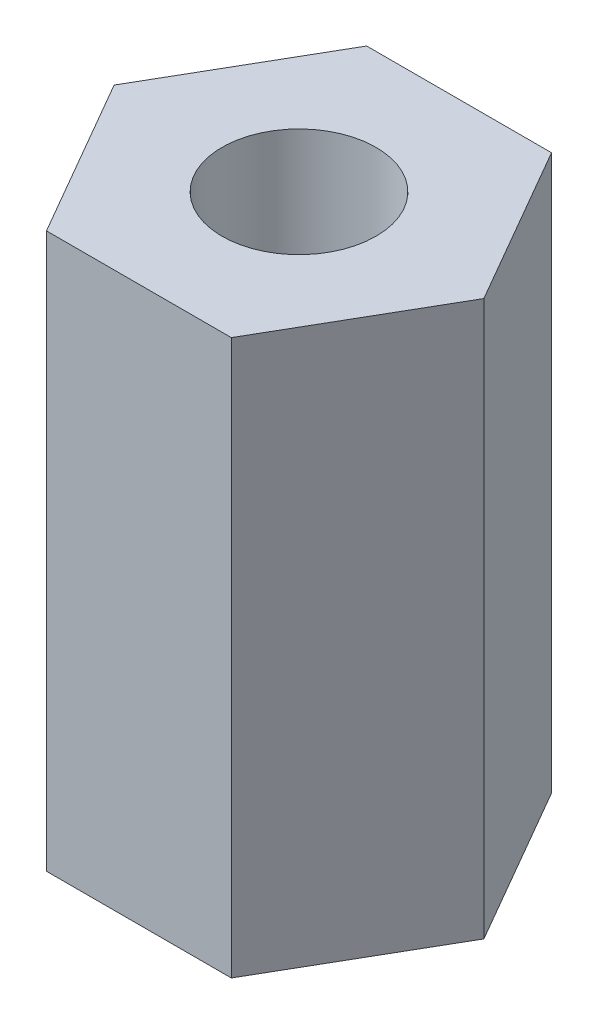
ISO-10303-21;
HEADER;
FILE_DESCRIPTION(('STEP AP214'),'2;1');
FILE_NAME('part.step','',(''),(''),'','','');
FILE_SCHEMA(('AUTOMOTIVE_DESIGN { 1 0 10303 214 1 1 1 1 }'));
ENDSEC;
DATA;
#1=APPLICATION_CONTEXT('core data for automotive mechanical design processes');
#2=APPLICATION_PROTOCOL_DEFINITION('international standard','automotive_design',2000,#1);
#3=PRODUCT_CONTEXT('',#1,'mechanical');
#4=PRODUCT('Part','Part','',(#3));
#5=PRODUCT_RELATED_PRODUCT_CATEGORY('part','',(#4));
#6=PRODUCT_DEFINITION_FORMATION('','',#4);
#7=PRODUCT_DEFINITION_CONTEXT('part definition',#1,'design');
#8=PRODUCT_DEFINITION('design','',#6,#7);
#9=PRODUCT_DEFINITION_SHAPE('','',#8);
#10=(LENGTH_UNIT() NAMED_UNIT(*) SI_UNIT(.MILLI.,.METRE.));
#11=(NAMED_UNIT(*) PLANE_ANGLE_UNIT() SI_UNIT($,.RADIAN.));
#12=(NAMED_UNIT(*) SI_UNIT($,.STERADIAN.) SOLID_ANGLE_UNIT());
#13=UNCERTAINTY_MEASURE_WITH_UNIT(LENGTH_MEASURE(1.E-05),#10,'distance_accuracy_value','');
#14=(GEOMETRIC_REPRESENTATION_CONTEXT(3) GLOBAL_UNCERTAINTY_ASSIGNED_CONTEXT((#13)) GLOBAL_UNIT_ASSIGNED_CONTEXT((#10,
#11,#12)) REPRESENTATION_CONTEXT('',''));
#15=CARTESIAN_POINT('',(0.,0.,0.));
#16=DIRECTION('',(0.,0.,1.));
#17=DIRECTION('',(1.,0.,0.));
#18=AXIS2_PLACEMENT_3D('',#15,#16,#17);
#19=CARTESIAN_POINT('',(1.5,-19.8,-2.598076211));
#20=DIRECTION('',(-0.866025403754996,0.,0.500000000050997));
#21=DIRECTION('',(0.500000000050997,0.,0.866025403754996));
#22=AXIS2_PLACEMENT_3D('',#19,#20,#21);
#23=PLANE('',#22);
#24=DIRECTION('',(-0.500000000039245,0.,-0.86602540376178));
#25=VECTOR('',#24,1.);
#26=CARTESIAN_POINT('',(2.9999999999914,-11.,1.48889425227083E-11));
#27=LINE('',#26,#25);
#28=CARTESIAN_POINT('',(2.99999999994471,-11.,-8.08820188573774E-11));
#29=VERTEX_POINT('',#28);
#30=CARTESIAN_POINT('',(1.49999999996019,-11.,-2.59807621099354));
#31=VERTEX_POINT('',#30);
#32=EDGE_CURVE('E112',#29,#31,#27,.T.);
#33=ORIENTED_EDGE('',*,*,#32,.F.);
#34=DIRECTION('',(0.,1.,0.));
#35=VECTOR('',#34,1.);
#36=CARTESIAN_POINT('',(2.9999999999914,-19.8,1.48888315316058E-11));
#37=LINE('',#36,#35);
#38=CARTESIAN_POINT('',(2.99999999984486,-20.,-8.46048744331994E-11));
#39=VERTEX_POINT('',#38);
#40=EDGE_CURVE('E90',#29,#39,#37,.F.);
#41=ORIENTED_EDGE('',*,*,#40,.T.);
#42=DIRECTION('',(-0.5,0.,-0.866025403784439));
#43=VECTOR('',#42,1.);
#44=CARTESIAN_POINT('',(2.99999999959204,-20.,0.));
#45=LINE('',#44,#43);
#46=CARTESIAN_POINT('',(1.49999999990174,-20.,-2.59807621099355));
#47=VERTEX_POINT('',#46);
#48=EDGE_CURVE('E66',#39,#47,#45,.T.);
#49=ORIENTED_EDGE('',*,*,#48,.T.);
#50=DIRECTION('',(0.,1.,0.));
#51=VECTOR('',#50,1.);
#52=CARTESIAN_POINT('',(1.49999999979602,-19.8,-2.598076211));
#53=LINE('',#52,#51);
#54=EDGE_CURVE('E73',#47,#31,#53,.T.);
#55=ORIENTED_EDGE('',*,*,#54,.T.);
#56=EDGE_LOOP('',(#33,#41,#49,#55));
#57=FACE_BOUND('',#56,.T.);
#58=ADVANCED_FACE('F17',(#57),#23,.F.);
#59=CARTESIAN_POINT('',(-1.5,-19.8,-2.598076211));
#60=DIRECTION('',(0.,0.,1.));
#61=DIRECTION('',(1.,0.,0.));
#62=AXIS2_PLACEMENT_3D('',#59,#60,#61);
#63=PLANE('',#62);
#64=DIRECTION('',(1.,0.,0.));
#65=VECTOR('',#64,1.);
#66=CARTESIAN_POINT('',(0.,-11.,-2.598076211));
#67=LINE('',#66,#65);
#68=CARTESIAN_POINT('',(-1.4999999999788,-11.,-2.59807621102208));
#69=VERTEX_POINT('',#68);
#70=EDGE_CURVE('E77',#31,#69,#67,.F.);
#71=ORIENTED_EDGE('',*,*,#70,.F.);
#72=ORIENTED_EDGE('',*,*,#54,.F.);
#73=DIRECTION('',(1.,0.,0.));
#74=VECTOR('',#73,1.);
#75=CARTESIAN_POINT('',(-2.802288611,-20.,-2.59807621100001));
#76=LINE('',#75,#74);
#77=CARTESIAN_POINT('',(-1.4999999999278,-20.,-2.59807621102209));
#78=VERTEX_POINT('',#77);
#79=EDGE_CURVE('E76',#47,#78,#76,.F.);
#80=ORIENTED_EDGE('',*,*,#79,.T.);
#81=DIRECTION('',(0.,1.,0.));
#82=VECTOR('',#81,1.);
#83=CARTESIAN_POINT('',(-1.499999999949,-19.8,-2.59807621108834));
#84=LINE('',#83,#82);
#85=EDGE_CURVE('E80',#78,#69,#84,.T.);
#86=ORIENTED_EDGE('',*,*,#85,.T.);
#87=EDGE_LOOP('',(#71,#72,#80,#86));
#88=FACE_BOUND('',#87,.T.);
#89=ADVANCED_FACE('F74',(#88),#63,.F.);
#90=CARTESIAN_POINT('',(-3.,-19.8,0.));
#91=DIRECTION('',(0.866025403754996,0.,0.500000000050997));
#92=DIRECTION('',(0.500000000050997,0.,-0.866025403754996));
#93=AXIS2_PLACEMENT_3D('',#90,#91,#92);
#94=PLANE('',#93);
#95=DIRECTION('',(-0.50000000001215,0.,0.866025403777424));
#96=VECTOR('',#95,1.);
#97=CARTESIAN_POINT('',(-1.4999999999831,-11.,-2.59807621102927));
#98=LINE('',#97,#96);
#99=CARTESIAN_POINT('',(-2.9999999999745,-11.,1.11448339535898E-10));
#100=VERTEX_POINT('',#99);
#101=EDGE_CURVE('E106',#69,#100,#98,.T.);
#102=ORIENTED_EDGE('',*,*,#101,.F.);
#103=ORIENTED_EDGE('',*,*,#85,.F.);
#104=DIRECTION('',(-0.5,0.,0.866025403784439));
#105=VECTOR('',#104,1.);
#106=CARTESIAN_POINT('',(-1.49999999979602,-20.,-2.59807621100001));
#107=LINE('',#106,#105);
#108=CARTESIAN_POINT('',(-2.99999999989193,-20.,7.78060918561481E-11));
#109=VERTEX_POINT('',#108);
#110=EDGE_CURVE('E88',#78,#109,#107,.T.);
#111=ORIENTED_EDGE('',*,*,#110,.T.);
#112=DIRECTION('',(0.,1.,0.));
#113=VECTOR('',#112,1.);
#114=CARTESIAN_POINT('',(-2.99999999989801,-19.8,1.76653830452622E-10));
#115=LINE('',#114,#113);
#116=EDGE_CURVE('E101',#109,#100,#115,.T.);
#117=ORIENTED_EDGE('',*,*,#116,.T.);
#118=EDGE_LOOP('',(#102,#103,#111,#117));
#119=FACE_BOUND('',#118,.T.);
#120=ADVANCED_FACE('F107',(#119),#94,.F.);
#121=CARTESIAN_POINT('',(-1.5,-19.8,2.598076211));
#122=DIRECTION('',(0.866025403754996,0.,-0.500000000050997));
#123=DIRECTION('',(-0.500000000050997,0.,-0.866025403754996));
#124=AXIS2_PLACEMENT_3D('',#121,#122,#123);
#125=PLANE('',#124);
#126=DIRECTION('',(0.500000000043543,0.,0.866025403759299));
#127=VECTOR('',#126,1.);
#128=CARTESIAN_POINT('',(-2.99999999992231,-11.,1.34569872606294E-10));
#129=LINE('',#128,#127);
#130=CARTESIAN_POINT('',(-1.49999999996019,-11.,2.59807621099354));
#131=VERTEX_POINT('',#130);
#132=EDGE_CURVE('E109',#100,#131,#129,.T.);
#133=ORIENTED_EDGE('',*,*,#132,.F.);
#134=ORIENTED_EDGE('',*,*,#116,.F.);
#135=DIRECTION('',(0.5,0.,0.866025403784439));
#136=VECTOR('',#135,1.);
#137=CARTESIAN_POINT('',(-2.99999999959203,-20.,0.));
#138=LINE('',#137,#136);
#139=CARTESIAN_POINT('',(-1.49999999990174,-20.,2.59807621099355));
#140=VERTEX_POINT('',#139);
#141=EDGE_CURVE('E122',#109,#140,#138,.T.);
#142=ORIENTED_EDGE('',*,*,#141,.T.);
#143=DIRECTION('',(0.,1.,0.));
#144=VECTOR('',#143,1.);
#145=CARTESIAN_POINT('',(-1.49999999979602,-19.8,2.598076211));
#146=LINE('',#145,#144);
#147=EDGE_CURVE('E98',#140,#131,#146,.T.);
#148=ORIENTED_EDGE('',*,*,#147,.T.);
#149=EDGE_LOOP('',(#133,#134,#142,#148));
#150=FACE_BOUND('',#149,.T.);
#151=ADVANCED_FACE('F125',(#150),#125,.F.);
#152=CARTESIAN_POINT('',(1.5,-19.8,2.598076211));
#153=DIRECTION('',(0.,0.,-1.));
#154=DIRECTION('',(-1.,0.,0.));
#155=AXIS2_PLACEMENT_3D('',#152,#153,#154);
#156=PLANE('',#155);
#157=DIRECTION('',(1.,0.,0.));
#158=VECTOR('',#157,1.);
#159=CARTESIAN_POINT('',(0.,-11.,2.598076211));
#160=LINE('',#159,#158);
#161=CARTESIAN_POINT('',(1.49999999998725,-11.,2.59807621102208));
#162=VERTEX_POINT('',#161);
#163=EDGE_CURVE('E33',#131,#162,#160,.T.);
#164=ORIENTED_EDGE('',*,*,#163,.F.);
#165=ORIENTED_EDGE('',*,*,#147,.F.);
#166=DIRECTION('',(1.,0.,0.));
#167=VECTOR('',#166,1.);
#168=CARTESIAN_POINT('',(-2.802288611,-20.,2.59807621100001));
#169=LINE('',#168,#167);
#170=CARTESIAN_POINT('',(1.49999999993625,-20.,2.59807621102209));
#171=VERTEX_POINT('',#170);
#172=EDGE_CURVE('E119',#140,#171,#169,.T.);
#173=ORIENTED_EDGE('',*,*,#172,.T.);
#174=DIRECTION('',(0.,1.,0.));
#175=VECTOR('',#174,1.);
#176=CARTESIAN_POINT('',(1.499999999949,-19.8,2.59807621108833));
#177=LINE('',#176,#175);
#178=EDGE_CURVE('E93',#171,#162,#177,.T.);
#179=ORIENTED_EDGE('',*,*,#178,.T.);
#180=EDGE_LOOP('',(#164,#165,#173,#179));
#181=FACE_BOUND('',#180,.T.);
#182=ADVANCED_FACE('F127',(#181),#156,.F.);
#183=CARTESIAN_POINT('',(3.,-19.8,0.));
#184=DIRECTION('',(-0.866025403754996,0.,-0.500000000050997));
#185=DIRECTION('',(-0.500000000050997,0.,0.866025403754996));
#186=AXIS2_PLACEMENT_3D('',#183,#184,#185);
#187=PLANE('',#186);
#188=ORIENTED_EDGE('',*,*,#40,.F.);
#189=DIRECTION('',(0.500000000050997,0.,-0.866025403754996));
#190=VECTOR('',#189,1.);
#191=CARTESIAN_POINT('',(1.5,-11.,2.598076211));
#192=LINE('',#191,#190);
#193=EDGE_CURVE('E129',#162,#29,#192,.T.);
#194=ORIENTED_EDGE('',*,*,#193,.F.);
#195=ORIENTED_EDGE('',*,*,#178,.F.);
#196=DIRECTION('',(0.5,0.,-0.866025403784439));
#197=VECTOR('',#196,1.);
#198=CARTESIAN_POINT('',(1.49999999979602,-20.,2.59807621100001));
#199=LINE('',#198,#197);
#200=EDGE_CURVE('E117',#171,#39,#199,.T.);
#201=ORIENTED_EDGE('',*,*,#200,.T.);
#202=EDGE_LOOP('',(#188,#194,#195,#201));
#203=FACE_BOUND('',#202,.T.);
#204=ADVANCED_FACE('F147',(#203),#187,.F.);
#205=CARTESIAN_POINT('',(-2.802288611,-20.,-2.398076211));
#206=DIRECTION('',(0.,1.,0.));
#207=DIRECTION('',(0.,0.,1.));
#208=AXIS2_PLACEMENT_3D('',#205,#206,#207);
#209=PLANE('',#208);
#210=ORIENTED_EDGE('',*,*,#172,.F.);
#211=ORIENTED_EDGE('',*,*,#141,.F.);
#212=ORIENTED_EDGE('',*,*,#110,.F.);
#213=ORIENTED_EDGE('',*,*,#79,.F.);
#214=ORIENTED_EDGE('',*,*,#48,.F.);
#215=ORIENTED_EDGE('',*,*,#200,.F.);
#216=EDGE_LOOP('',(#210,#211,#212,#213,#214,#215));
#217=FACE_BOUND('',#216,.T.);
#218=CARTESIAN_POINT('',(0.,-20.,0.));
#219=DIRECTION('',(0.,-1.,0.));
#220=DIRECTION('',(1.,0.,0.));
#221=AXIS2_PLACEMENT_3D('',#218,#219,#220);
#222=CIRCLE('',#221,1.25);
#223=CARTESIAN_POINT('',(1.25000000000001,-20.,0.));
#224=VERTEX_POINT('',#223);
#225=EDGE_CURVE('E20',#224,#224,#222,.F.);
#226=ORIENTED_EDGE('',*,*,#225,.T.);
#227=EDGE_LOOP('',(#226));
#228=FACE_BOUND('',#227,.T.);
#229=ADVANCED_FACE('F84',(#217,#228),#209,.F.);
#230=CARTESIAN_POINT('',(0.,-11.,0.));
#231=DIRECTION('',(0.,1.,0.));
#232=DIRECTION('',(0.,0.,1.));
#233=AXIS2_PLACEMENT_3D('',#230,#231,#232);
#234=PLANE('',#233);
#235=ORIENTED_EDGE('',*,*,#163,.T.);
#236=ORIENTED_EDGE('',*,*,#193,.T.);
#237=ORIENTED_EDGE('',*,*,#32,.T.);
#238=ORIENTED_EDGE('',*,*,#70,.T.);
#239=ORIENTED_EDGE('',*,*,#101,.T.);
#240=ORIENTED_EDGE('',*,*,#132,.T.);
#241=EDGE_LOOP('',(#235,#236,#237,#238,#239,#240));
#242=FACE_BOUND('',#241,.T.);
#243=CARTESIAN_POINT('',(0.,-11.,0.));
#244=DIRECTION('',(0.,-1.,0.));
#245=DIRECTION('',(1.,0.,0.));
#246=AXIS2_PLACEMENT_3D('',#243,#244,#245);
#247=CIRCLE('',#246,1.25);
#248=CARTESIAN_POINT('',(1.25,-11.,0.));
#249=VERTEX_POINT('',#248);
#250=EDGE_CURVE('E11',#249,#249,#247,.T.);
#251=ORIENTED_EDGE('',*,*,#250,.T.);
#252=EDGE_LOOP('',(#251));
#253=FACE_BOUND('',#252,.T.);
#254=ADVANCED_FACE('F137',(#242,#253),#234,.T.);
#255=CARTESIAN_POINT('',(0.,-10.,0.));
#256=DIRECTION('',(0.,-1.,0.));
#257=DIRECTION('',(1.,0.,0.));
#258=AXIS2_PLACEMENT_3D('',#255,#256,#257);
#259=CYLINDRICAL_SURFACE('',#258,1.25);
#260=ORIENTED_EDGE('',*,*,#225,.F.);
#261=EDGE_LOOP('',(#260));
#262=FACE_BOUND('',#261,.T.);
#263=ORIENTED_EDGE('',*,*,#250,.F.);
#264=EDGE_LOOP('',(#263));
#265=FACE_BOUND('',#264,.T.);
#266=ADVANCED_FACE('F134',(#262,#265),#259,.F.);
#267=CLOSED_SHELL('',(#58,#89,#120,#151,#182,#204,#229,#254,#266));
#268=MANIFOLD_SOLID_BREP('B1',#267);
#269=ADVANCED_BREP_SHAPE_REPRESENTATION('',(#18,#268),#14);
#270=SHAPE_DEFINITION_REPRESENTATION(#9,#269);
ENDSEC;
END-ISO-10303-21;
